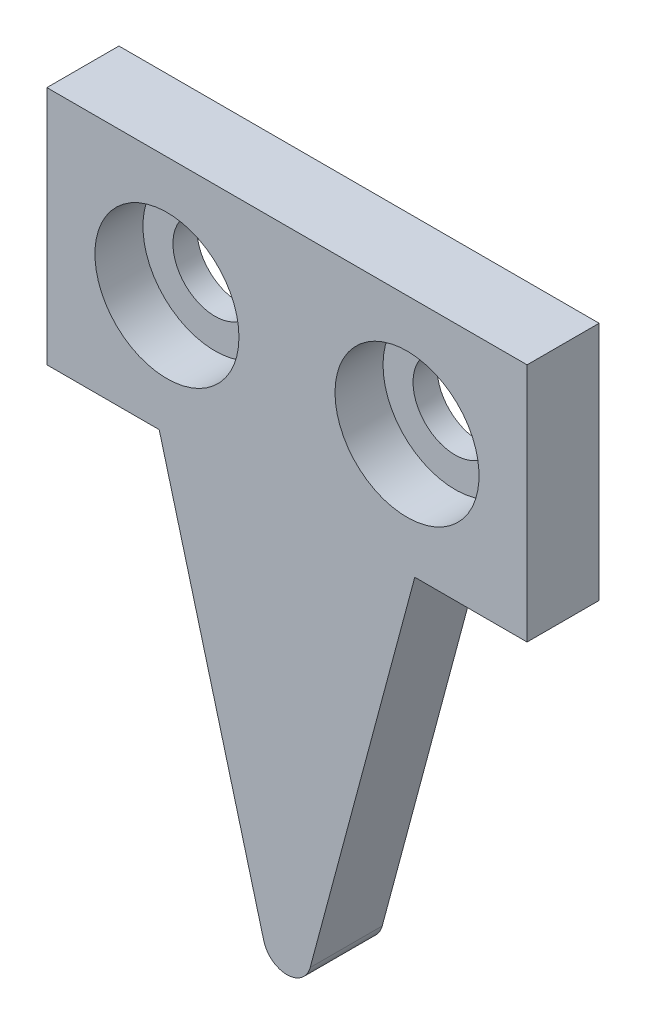
ISO-10303-21;
HEADER;
FILE_DESCRIPTION(('STEP AP214'),'2;1');
FILE_NAME('part.step','',(''),(''),'','','');
FILE_SCHEMA(('AUTOMOTIVE_DESIGN { 1 0 10303 214 1 1 1 1 }'));
ENDSEC;
DATA;
#1=APPLICATION_CONTEXT('core data for automotive mechanical design processes');
#2=APPLICATION_PROTOCOL_DEFINITION('international standard','automotive_design',2000,#1);
#3=PRODUCT_CONTEXT('',#1,'mechanical');
#4=PRODUCT('Part','Part','',(#3));
#5=PRODUCT_RELATED_PRODUCT_CATEGORY('part','',(#4));
#6=PRODUCT_DEFINITION_FORMATION('','',#4);
#7=PRODUCT_DEFINITION_CONTEXT('part definition',#1,'design');
#8=PRODUCT_DEFINITION('design','',#6,#7);
#9=PRODUCT_DEFINITION_SHAPE('','',#8);
#10=(LENGTH_UNIT() NAMED_UNIT(*) SI_UNIT(.MILLI.,.METRE.));
#11=(NAMED_UNIT(*) PLANE_ANGLE_UNIT() SI_UNIT($,.RADIAN.));
#12=(NAMED_UNIT(*) SI_UNIT($,.STERADIAN.) SOLID_ANGLE_UNIT());
#13=UNCERTAINTY_MEASURE_WITH_UNIT(LENGTH_MEASURE(1.E-05),#10,'distance_accuracy_value','');
#14=(GEOMETRIC_REPRESENTATION_CONTEXT(3) GLOBAL_UNCERTAINTY_ASSIGNED_CONTEXT((#13)) GLOBAL_UNIT_ASSIGNED_CONTEXT((#10,
#11,#12)) REPRESENTATION_CONTEXT('',''));
#15=CARTESIAN_POINT('',(0.,0.,0.));
#16=DIRECTION('',(0.,0.,1.));
#17=DIRECTION('',(1.,0.,0.));
#18=AXIS2_PLACEMENT_3D('',#15,#16,#17);
#19=CARTESIAN_POINT('',(-5.,21.,-4.94974746830585));
#20=DIRECTION('',(0.,0.,1.));
#21=DIRECTION('',(1.,0.,0.));
#22=AXIS2_PLACEMENT_3D('',#19,#20,#21);
#23=CYLINDRICAL_SURFACE('',#22,1.75);
#24=CARTESIAN_POINT('',(-5.,21.,0.));
#25=DIRECTION('',(0.,0.,1.));
#26=DIRECTION('',(1.,0.,0.));
#27=AXIS2_PLACEMENT_3D('',#24,#25,#26);
#28=CIRCLE('',#27,1.75);
#29=CARTESIAN_POINT('',(-3.25,21.,0.));
#30=VERTEX_POINT('',#29);
#31=EDGE_CURVE('E145',#30,#30,#28,.F.);
#32=ORIENTED_EDGE('',*,*,#31,.T.);
#33=EDGE_LOOP('',(#32));
#34=FACE_BOUND('',#33,.T.);
#35=CARTESIAN_POINT('',(-5.,21.,1.));
#36=DIRECTION('',(0.,0.,1.));
#37=DIRECTION('',(1.,0.,0.));
#38=AXIS2_PLACEMENT_3D('',#35,#36,#37);
#39=CIRCLE('',#38,1.75);
#40=CARTESIAN_POINT('',(-3.25,21.,1.));
#41=VERTEX_POINT('',#40);
#42=EDGE_CURVE('E165',#41,#41,#39,.F.);
#43=ORIENTED_EDGE('',*,*,#42,.F.);
#44=EDGE_LOOP('',(#43));
#45=FACE_BOUND('',#44,.T.);
#46=ADVANCED_FACE('F39',(#34,#45),#23,.F.);
#47=CARTESIAN_POINT('',(10.,16.,3.));
#48=DIRECTION('',(-1.,0.,0.));
#49=DIRECTION('',(0.,0.,1.));
#50=AXIS2_PLACEMENT_3D('',#47,#48,#49);
#51=PLANE('',#50);
#52=DIRECTION('',(0.,1.,0.));
#53=VECTOR('',#52,1.);
#54=CARTESIAN_POINT('',(10.,16.,0.));
#55=LINE('',#54,#53);
#56=CARTESIAN_POINT('',(10.,16.,0.));
#57=VERTEX_POINT('',#56);
#58=CARTESIAN_POINT('',(10.,26.,0.));
#59=VERTEX_POINT('',#58);
#60=EDGE_CURVE('E136',#57,#59,#55,.T.);
#61=ORIENTED_EDGE('',*,*,#60,.T.);
#62=DIRECTION('',(0.,0.,-1.));
#63=VECTOR('',#62,1.);
#64=CARTESIAN_POINT('',(10.,26.,3.));
#65=LINE('',#64,#63);
#66=CARTESIAN_POINT('',(10.,26.,3.));
#67=VERTEX_POINT('',#66);
#68=EDGE_CURVE('E11',#67,#59,#65,.T.);
#69=ORIENTED_EDGE('',*,*,#68,.F.);
#70=DIRECTION('',(0.,1.,0.));
#71=VECTOR('',#70,1.);
#72=CARTESIAN_POINT('',(10.,16.,3.));
#73=LINE('',#72,#71);
#74=CARTESIAN_POINT('',(10.,16.,3.));
#75=VERTEX_POINT('',#74);
#76=EDGE_CURVE('E153',#75,#67,#73,.T.);
#77=ORIENTED_EDGE('',*,*,#76,.F.);
#78=DIRECTION('',(0.,0.,-1.));
#79=VECTOR('',#78,1.);
#80=CARTESIAN_POINT('',(10.,16.,3.));
#81=LINE('',#80,#79);
#82=EDGE_CURVE('E132',#75,#57,#81,.T.);
#83=ORIENTED_EDGE('',*,*,#82,.T.);
#84=EDGE_LOOP('',(#61,#69,#77,#83));
#85=FACE_BOUND('',#84,.T.);
#86=ADVANCED_FACE('F41',(#85),#51,.F.);
#87=CARTESIAN_POINT('',(-10.,26.,3.));
#88=DIRECTION('',(0.,-1.,0.));
#89=DIRECTION('',(0.,0.,-1.));
#90=AXIS2_PLACEMENT_3D('',#87,#88,#89);
#91=PLANE('',#90);
#92=DIRECTION('',(-1.,0.,0.));
#93=VECTOR('',#92,1.);
#94=CARTESIAN_POINT('',(-10.,26.,0.));
#95=LINE('',#94,#93);
#96=CARTESIAN_POINT('',(-10.,26.,0.));
#97=VERTEX_POINT('',#96);
#98=EDGE_CURVE('E142',#59,#97,#95,.T.);
#99=ORIENTED_EDGE('',*,*,#98,.T.);
#100=DIRECTION('',(0.,0.,-1.));
#101=VECTOR('',#100,1.);
#102=CARTESIAN_POINT('',(-10.,26.,3.));
#103=LINE('',#102,#101);
#104=CARTESIAN_POINT('',(-10.,26.,3.));
#105=VERTEX_POINT('',#104);
#106=EDGE_CURVE('E47',#105,#97,#103,.T.);
#107=ORIENTED_EDGE('',*,*,#106,.F.);
#108=DIRECTION('',(-1.,0.,0.));
#109=VECTOR('',#108,1.);
#110=CARTESIAN_POINT('',(-10.,26.,3.));
#111=LINE('',#110,#109);
#112=EDGE_CURVE('E103',#67,#105,#111,.T.);
#113=ORIENTED_EDGE('',*,*,#112,.F.);
#114=ORIENTED_EDGE('',*,*,#68,.T.);
#115=EDGE_LOOP('',(#99,#107,#113,#114));
#116=FACE_BOUND('',#115,.T.);
#117=ADVANCED_FACE('F230',(#116),#91,.F.);
#118=CARTESIAN_POINT('',(-10.,16.,3.));
#119=DIRECTION('',(1.,0.,0.));
#120=DIRECTION('',(0.,0.,-1.));
#121=AXIS2_PLACEMENT_3D('',#118,#119,#120);
#122=PLANE('',#121);
#123=DIRECTION('',(0.,-1.,0.));
#124=VECTOR('',#123,1.);
#125=CARTESIAN_POINT('',(-10.,16.,0.));
#126=LINE('',#125,#124);
#127=CARTESIAN_POINT('',(-10.,16.,0.));
#128=VERTEX_POINT('',#127);
#129=EDGE_CURVE('E144',#97,#128,#126,.T.);
#130=ORIENTED_EDGE('',*,*,#129,.T.);
#131=DIRECTION('',(0.,0.,-1.));
#132=VECTOR('',#131,1.);
#133=CARTESIAN_POINT('',(-10.,16.,3.));
#134=LINE('',#133,#132);
#135=CARTESIAN_POINT('',(-10.,16.,3.));
#136=VERTEX_POINT('',#135);
#137=EDGE_CURVE('E157',#136,#128,#134,.T.);
#138=ORIENTED_EDGE('',*,*,#137,.F.);
#139=DIRECTION('',(0.,-1.,0.));
#140=VECTOR('',#139,1.);
#141=CARTESIAN_POINT('',(-10.,16.,3.));
#142=LINE('',#141,#140);
#143=EDGE_CURVE('E192',#105,#136,#142,.T.);
#144=ORIENTED_EDGE('',*,*,#143,.F.);
#145=ORIENTED_EDGE('',*,*,#106,.T.);
#146=EDGE_LOOP('',(#130,#138,#144,#145));
#147=FACE_BOUND('',#146,.T.);
#148=ADVANCED_FACE('F342',(#147),#122,.F.);
#149=CARTESIAN_POINT('',(-5.32246325930812,16.,3.));
#150=DIRECTION('',(0.,1.,0.));
#151=DIRECTION('',(-1.,0.,0.));
#152=AXIS2_PLACEMENT_3D('',#149,#150,#151);
#153=PLANE('',#152);
#154=DIRECTION('',(1.,0.,0.));
#155=VECTOR('',#154,1.);
#156=CARTESIAN_POINT('',(-5.32246325930812,16.,0.));
#157=LINE('',#156,#155);
#158=CARTESIAN_POINT('',(-5.32246325930812,16.,0.));
#159=VERTEX_POINT('',#158);
#160=EDGE_CURVE('E147',#128,#159,#157,.T.);
#161=ORIENTED_EDGE('',*,*,#160,.T.);
#162=DIRECTION('',(0.,0.,-1.));
#163=VECTOR('',#162,1.);
#164=CARTESIAN_POINT('',(-5.32246325930812,16.,3.));
#165=LINE('',#164,#163);
#166=CARTESIAN_POINT('',(-5.32246325930812,16.,3.));
#167=VERTEX_POINT('',#166);
#168=EDGE_CURVE('E160',#167,#159,#165,.T.);
#169=ORIENTED_EDGE('',*,*,#168,.F.);
#170=DIRECTION('',(1.,0.,0.));
#171=VECTOR('',#170,1.);
#172=CARTESIAN_POINT('',(-5.32246325930812,16.,3.));
#173=LINE('',#172,#171);
#174=EDGE_CURVE('E194',#136,#167,#173,.T.);
#175=ORIENTED_EDGE('',*,*,#174,.F.);
#176=ORIENTED_EDGE('',*,*,#137,.T.);
#177=EDGE_LOOP('',(#161,#169,#175,#176));
#178=FACE_BOUND('',#177,.T.);
#179=ADVANCED_FACE('F197',(#178),#153,.F.);
#180=CARTESIAN_POINT('',(-5.32246325930812,16.,3.));
#181=DIRECTION('',(0.965925826289067,0.258819045102525,0.));
#182=DIRECTION('',(-0.258819045102525,0.965925826289067,0.));
#183=AXIS2_PLACEMENT_3D('',#180,#181,#182);
#184=PLANE('',#183);
#185=DIRECTION('',(0.258819045102525,-0.965925826289067,0.));
#186=VECTOR('',#185,1.);
#187=CARTESIAN_POINT('',(-5.32246325930812,16.,0.));
#188=LINE('',#187,#186);
#189=CARTESIAN_POINT('',(-0.965925826289066,-0.258819045102525,0.));
#190=VERTEX_POINT('',#189);
#191=EDGE_CURVE('E149',#159,#190,#188,.T.);
#192=ORIENTED_EDGE('',*,*,#191,.T.);
#193=DIRECTION('',(0.,0.,-1.));
#194=VECTOR('',#193,1.);
#195=CARTESIAN_POINT('',(-0.965925826289066,-0.258819045102525,3.));
#196=LINE('',#195,#194);
#197=CARTESIAN_POINT('',(-0.965925826289066,-0.258819045102525,3.));
#198=VERTEX_POINT('',#197);
#199=EDGE_CURVE('E126',#198,#190,#196,.T.);
#200=ORIENTED_EDGE('',*,*,#199,.F.);
#201=DIRECTION('',(0.258819045102525,-0.965925826289067,0.));
#202=VECTOR('',#201,1.);
#203=CARTESIAN_POINT('',(-5.32246325930812,16.,3.));
#204=LINE('',#203,#202);
#205=EDGE_CURVE('E119',#167,#198,#204,.T.);
#206=ORIENTED_EDGE('',*,*,#205,.F.);
#207=ORIENTED_EDGE('',*,*,#168,.T.);
#208=EDGE_LOOP('',(#192,#200,#206,#207));
#209=FACE_BOUND('',#208,.T.);
#210=ADVANCED_FACE('F201',(#209),#184,.F.);
#211=CARTESIAN_POINT('',(0.,0.,3.));
#212=DIRECTION('',(0.,0.,-1.));
#213=DIRECTION('',(-1.,0.,0.));
#214=AXIS2_PLACEMENT_3D('',#211,#212,#213);
#215=CYLINDRICAL_SURFACE('',#214,0.999999999999999);
#216=CARTESIAN_POINT('',(0.,0.,0.));
#217=DIRECTION('',(0.,0.,1.));
#218=DIRECTION('',(1.,0.,0.));
#219=AXIS2_PLACEMENT_3D('',#216,#217,#218);
#220=CIRCLE('',#219,0.999999999999999);
#221=CARTESIAN_POINT('',(0.965925826289066,-0.258819045102525,0.));
#222=VERTEX_POINT('',#221);
#223=EDGE_CURVE('E129',#190,#222,#220,.T.);
#224=ORIENTED_EDGE('',*,*,#223,.T.);
#225=DIRECTION('',(0.,0.,-1.));
#226=VECTOR('',#225,1.);
#227=CARTESIAN_POINT('',(0.965925826289066,-0.258819045102525,3.));
#228=LINE('',#227,#226);
#229=CARTESIAN_POINT('',(0.965925826289066,-0.258819045102525,3.));
#230=VERTEX_POINT('',#229);
#231=EDGE_CURVE('E123',#230,#222,#228,.T.);
#232=ORIENTED_EDGE('',*,*,#231,.F.);
#233=CARTESIAN_POINT('',(0.,0.,3.));
#234=DIRECTION('',(0.,0.,1.));
#235=DIRECTION('',(1.,0.,0.));
#236=AXIS2_PLACEMENT_3D('',#233,#234,#235);
#237=CIRCLE('',#236,0.999999999999999);
#238=EDGE_CURVE('E112',#198,#230,#237,.T.);
#239=ORIENTED_EDGE('',*,*,#238,.F.);
#240=ORIENTED_EDGE('',*,*,#199,.T.);
#241=EDGE_LOOP('',(#224,#232,#239,#240));
#242=FACE_BOUND('',#241,.T.);
#243=ADVANCED_FACE('F127',(#242),#215,.T.);
#244=CARTESIAN_POINT('',(5.32246325930812,16.,3.));
#245=DIRECTION('',(-0.965925826289067,0.258819045102525,0.));
#246=DIRECTION('',(-0.258819045102525,-0.965925826289067,0.));
#247=AXIS2_PLACEMENT_3D('',#244,#245,#246);
#248=PLANE('',#247);
#249=DIRECTION('',(0.258819045102525,0.965925826289067,0.));
#250=VECTOR('',#249,1.);
#251=CARTESIAN_POINT('',(5.32246325930812,16.,0.));
#252=LINE('',#251,#250);
#253=CARTESIAN_POINT('',(5.32246325930812,16.,0.));
#254=VERTEX_POINT('',#253);
#255=EDGE_CURVE('E90',#222,#254,#252,.T.);
#256=ORIENTED_EDGE('',*,*,#255,.T.);
#257=DIRECTION('',(0.,0.,-1.));
#258=VECTOR('',#257,1.);
#259=CARTESIAN_POINT('',(5.32246325930812,16.,3.));
#260=LINE('',#259,#258);
#261=CARTESIAN_POINT('',(5.32246325930812,16.,3.));
#262=VERTEX_POINT('',#261);
#263=EDGE_CURVE('E128',#262,#254,#260,.T.);
#264=ORIENTED_EDGE('',*,*,#263,.F.);
#265=DIRECTION('',(0.258819045102525,0.965925826289067,0.));
#266=VECTOR('',#265,1.);
#267=CARTESIAN_POINT('',(5.32246325930812,16.,3.));
#268=LINE('',#267,#266);
#269=EDGE_CURVE('E117',#230,#262,#268,.T.);
#270=ORIENTED_EDGE('',*,*,#269,.F.);
#271=ORIENTED_EDGE('',*,*,#231,.T.);
#272=EDGE_LOOP('',(#256,#264,#270,#271));
#273=FACE_BOUND('',#272,.T.);
#274=ADVANCED_FACE('F135',(#273),#248,.F.);
#275=CARTESIAN_POINT('',(5.32246325930812,16.,3.));
#276=DIRECTION('',(0.,1.,0.));
#277=DIRECTION('',(-1.,0.,0.));
#278=AXIS2_PLACEMENT_3D('',#275,#276,#277);
#279=PLANE('',#278);
#280=DIRECTION('',(1.,0.,0.));
#281=VECTOR('',#280,1.);
#282=CARTESIAN_POINT('',(5.32246325930812,16.,0.));
#283=LINE('',#282,#281);
#284=EDGE_CURVE('E91',#254,#57,#283,.T.);
#285=ORIENTED_EDGE('',*,*,#284,.T.);
#286=ORIENTED_EDGE('',*,*,#82,.F.);
#287=DIRECTION('',(1.,0.,0.));
#288=VECTOR('',#287,1.);
#289=CARTESIAN_POINT('',(5.32246325930812,16.,3.));
#290=LINE('',#289,#288);
#291=EDGE_CURVE('E59',#262,#75,#290,.T.);
#292=ORIENTED_EDGE('',*,*,#291,.F.);
#293=ORIENTED_EDGE('',*,*,#263,.T.);
#294=EDGE_LOOP('',(#285,#286,#292,#293));
#295=FACE_BOUND('',#294,.T.);
#296=ADVANCED_FACE('F212',(#295),#279,.F.);
#297=CARTESIAN_POINT('',(0.,0.,3.));
#298=DIRECTION('',(0.,0.,1.));
#299=DIRECTION('',(1.,0.,0.));
#300=AXIS2_PLACEMENT_3D('',#297,#298,#299);
#301=PLANE('',#300);
#302=CARTESIAN_POINT('',(-5.,21.,3.));
#303=DIRECTION('',(0.,0.,1.));
#304=DIRECTION('',(1.,0.,0.));
#305=AXIS2_PLACEMENT_3D('',#302,#303,#304);
#306=CIRCLE('',#305,3.);
#307=CARTESIAN_POINT('',(-2.,21.,3.));
#308=VERTEX_POINT('',#307);
#309=EDGE_CURVE('E175',#308,#308,#306,.T.);
#310=ORIENTED_EDGE('',*,*,#309,.F.);
#311=EDGE_LOOP('',(#310));
#312=FACE_BOUND('',#311,.T.);
#313=CARTESIAN_POINT('',(5.,21.,3.));
#314=DIRECTION('',(0.,0.,1.));
#315=DIRECTION('',(-1.,0.,0.));
#316=AXIS2_PLACEMENT_3D('',#313,#314,#315);
#317=CIRCLE('',#316,3.);
#318=CARTESIAN_POINT('',(2.,21.,3.));
#319=VERTEX_POINT('',#318);
#320=EDGE_CURVE('E180',#319,#319,#317,.T.);
#321=ORIENTED_EDGE('',*,*,#320,.F.);
#322=EDGE_LOOP('',(#321));
#323=FACE_BOUND('',#322,.T.);
#324=ORIENTED_EDGE('',*,*,#76,.T.);
#325=ORIENTED_EDGE('',*,*,#112,.T.);
#326=ORIENTED_EDGE('',*,*,#143,.T.);
#327=ORIENTED_EDGE('',*,*,#174,.T.);
#328=ORIENTED_EDGE('',*,*,#205,.T.);
#329=ORIENTED_EDGE('',*,*,#238,.T.);
#330=ORIENTED_EDGE('',*,*,#269,.T.);
#331=ORIENTED_EDGE('',*,*,#291,.T.);
#332=EDGE_LOOP('',(#324,#325,#326,#327,#328,#329,#330,#331));
#333=FACE_BOUND('',#332,.T.);
#334=ADVANCED_FACE('F116',(#312,#323,#333),#301,.T.);
#335=CARTESIAN_POINT('',(0.,0.,0.));
#336=DIRECTION('',(0.,0.,1.));
#337=DIRECTION('',(1.,0.,0.));
#338=AXIS2_PLACEMENT_3D('',#335,#336,#337);
#339=PLANE('',#338);
#340=ORIENTED_EDGE('',*,*,#31,.F.);
#341=EDGE_LOOP('',(#340));
#342=FACE_BOUND('',#341,.T.);
#343=CARTESIAN_POINT('',(5.,21.,0.));
#344=DIRECTION('',(0.,0.,1.));
#345=DIRECTION('',(1.,0.,0.));
#346=AXIS2_PLACEMENT_3D('',#343,#344,#345);
#347=CIRCLE('',#346,1.75);
#348=CARTESIAN_POINT('',(6.75000000000001,21.,0.));
#349=VERTEX_POINT('',#348);
#350=EDGE_CURVE('E167',#349,#349,#347,.F.);
#351=ORIENTED_EDGE('',*,*,#350,.F.);
#352=EDGE_LOOP('',(#351));
#353=FACE_BOUND('',#352,.T.);
#354=ORIENTED_EDGE('',*,*,#60,.F.);
#355=ORIENTED_EDGE('',*,*,#284,.F.);
#356=ORIENTED_EDGE('',*,*,#255,.F.);
#357=ORIENTED_EDGE('',*,*,#223,.F.);
#358=ORIENTED_EDGE('',*,*,#191,.F.);
#359=ORIENTED_EDGE('',*,*,#160,.F.);
#360=ORIENTED_EDGE('',*,*,#129,.F.);
#361=ORIENTED_EDGE('',*,*,#98,.F.);
#362=EDGE_LOOP('',(#354,#355,#356,#357,#358,#359,#360,#361));
#363=FACE_BOUND('',#362,.T.);
#364=ADVANCED_FACE('F207',(#342,#353,#363),#339,.F.);
#365=CARTESIAN_POINT('',(5.,21.,-4.94974746830585));
#366=DIRECTION('',(0.,0.,1.));
#367=DIRECTION('',(1.,0.,0.));
#368=AXIS2_PLACEMENT_3D('',#365,#366,#367);
#369=CYLINDRICAL_SURFACE('',#368,1.75);
#370=CARTESIAN_POINT('',(5.,21.,1.));
#371=DIRECTION('',(0.,0.,-1.));
#372=DIRECTION('',(-1.,0.,0.));
#373=AXIS2_PLACEMENT_3D('',#370,#371,#372);
#374=CIRCLE('',#373,1.75);
#375=CARTESIAN_POINT('',(3.25,21.,1.));
#376=VERTEX_POINT('',#375);
#377=EDGE_CURVE('E43',#376,#376,#374,.F.);
#378=ORIENTED_EDGE('',*,*,#377,.T.);
#379=EDGE_LOOP('',(#378));
#380=FACE_BOUND('',#379,.T.);
#381=ORIENTED_EDGE('',*,*,#350,.T.);
#382=EDGE_LOOP('',(#381));
#383=FACE_BOUND('',#382,.T.);
#384=ADVANCED_FACE('F232',(#380,#383),#369,.F.);
#385=CARTESIAN_POINT('',(-5.,21.,1.));
#386=DIRECTION('',(0.,0.,1.));
#387=DIRECTION('',(1.,0.,0.));
#388=AXIS2_PLACEMENT_3D('',#385,#386,#387);
#389=PLANE('',#388);
#390=CARTESIAN_POINT('',(-5.,21.,1.));
#391=DIRECTION('',(0.,0.,1.));
#392=DIRECTION('',(1.,0.,0.));
#393=AXIS2_PLACEMENT_3D('',#390,#391,#392);
#394=CIRCLE('',#393,3.);
#395=CARTESIAN_POINT('',(-2.,21.,1.));
#396=VERTEX_POINT('',#395);
#397=EDGE_CURVE('E168',#396,#396,#394,.T.);
#398=ORIENTED_EDGE('',*,*,#397,.T.);
#399=EDGE_LOOP('',(#398));
#400=FACE_BOUND('',#399,.T.);
#401=ORIENTED_EDGE('',*,*,#42,.T.);
#402=EDGE_LOOP('',(#401));
#403=FACE_BOUND('',#402,.T.);
#404=ADVANCED_FACE('F240',(#400,#403),#389,.T.);
#405=CARTESIAN_POINT('',(-5.,21.,1.));
#406=DIRECTION('',(0.,0.,1.));
#407=DIRECTION('',(1.,0.,0.));
#408=AXIS2_PLACEMENT_3D('',#405,#406,#407);
#409=CYLINDRICAL_SURFACE('',#408,3.);
#410=ORIENTED_EDGE('',*,*,#397,.F.);
#411=EDGE_LOOP('',(#410));
#412=FACE_BOUND('',#411,.T.);
#413=ORIENTED_EDGE('',*,*,#309,.T.);
#414=EDGE_LOOP('',(#413));
#415=FACE_BOUND('',#414,.T.);
#416=ADVANCED_FACE('F267',(#412,#415),#409,.F.);
#417=CARTESIAN_POINT('',(5.,21.,1.));
#418=DIRECTION('',(0.,0.,-1.));
#419=DIRECTION('',(-1.,0.,0.));
#420=AXIS2_PLACEMENT_3D('',#417,#418,#419);
#421=PLANE('',#420);
#422=CARTESIAN_POINT('',(5.,21.,1.));
#423=DIRECTION('',(0.,0.,1.));
#424=DIRECTION('',(-1.,0.,0.));
#425=AXIS2_PLACEMENT_3D('',#422,#423,#424);
#426=CIRCLE('',#425,3.);
#427=CARTESIAN_POINT('',(2.,21.,1.));
#428=VERTEX_POINT('',#427);
#429=EDGE_CURVE('E185',#428,#428,#426,.T.);
#430=ORIENTED_EDGE('',*,*,#429,.T.);
#431=EDGE_LOOP('',(#430));
#432=FACE_BOUND('',#431,.T.);
#433=ORIENTED_EDGE('',*,*,#377,.F.);
#434=EDGE_LOOP('',(#433));
#435=FACE_BOUND('',#434,.T.);
#436=ADVANCED_FACE('F231',(#432,#435),#421,.F.);
#437=CARTESIAN_POINT('',(5.,21.,1.));
#438=DIRECTION('',(0.,0.,1.));
#439=DIRECTION('',(1.,0.,0.));
#440=AXIS2_PLACEMENT_3D('',#437,#438,#439);
#441=CYLINDRICAL_SURFACE('',#440,3.);
#442=ORIENTED_EDGE('',*,*,#429,.F.);
#443=EDGE_LOOP('',(#442));
#444=FACE_BOUND('',#443,.T.);
#445=ORIENTED_EDGE('',*,*,#320,.T.);
#446=EDGE_LOOP('',(#445));
#447=FACE_BOUND('',#446,.T.);
#448=ADVANCED_FACE('F286',(#444,#447),#441,.F.);
#449=CLOSED_SHELL('',(#46,#86,#117,#148,#179,#210,#243,#274,#296,#334,#364,#384,#404,#416,#436,#448));
#450=MANIFOLD_SOLID_BREP('B2',#449);
#451=ADVANCED_BREP_SHAPE_REPRESENTATION('',(#18,#450),#14);
#452=SHAPE_DEFINITION_REPRESENTATION(#9,#451);
ENDSEC;
END-ISO-10303-21;
